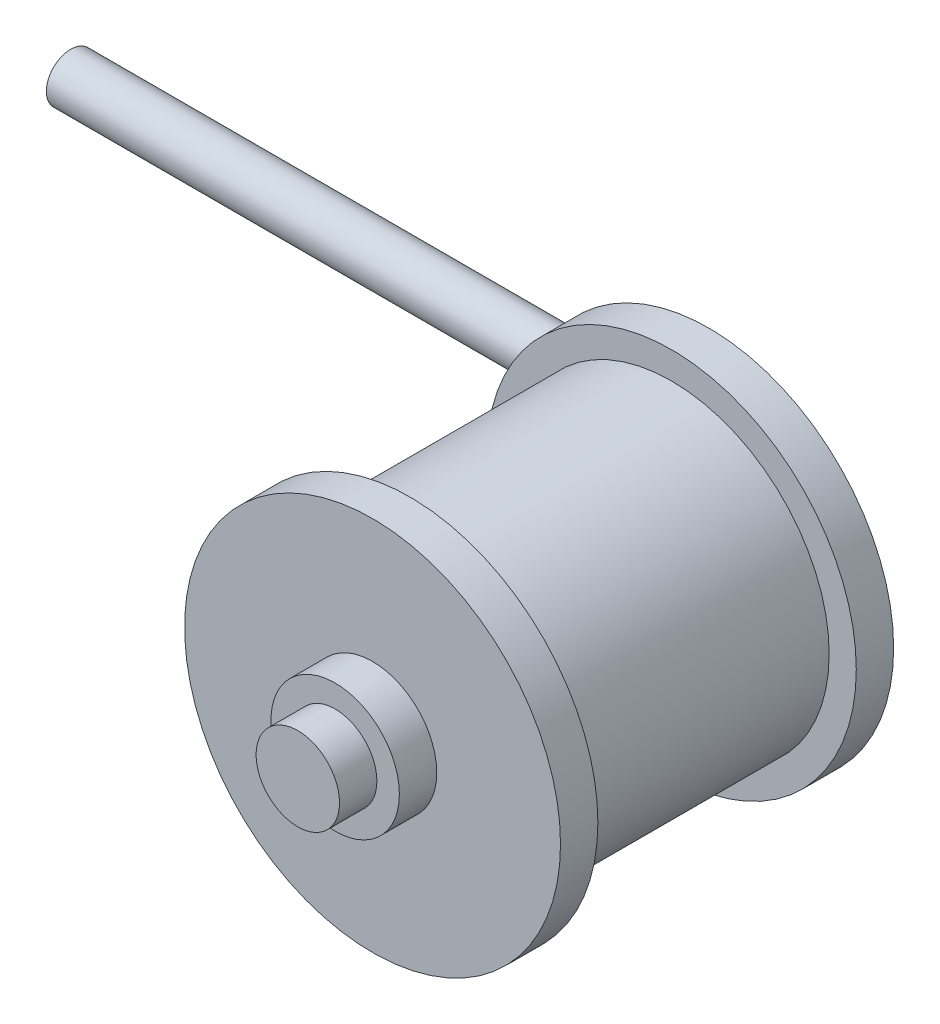
ISO-10303-21;
HEADER;
FILE_DESCRIPTION(('STEP AP214'),'2;1');
FILE_NAME('part.step','',(''),(''),'','','');
FILE_SCHEMA(('AUTOMOTIVE_DESIGN { 1 0 10303 214 1 1 1 1 }'));
ENDSEC;
DATA;
#1=APPLICATION_CONTEXT('core data for automotive mechanical design processes');
#2=APPLICATION_PROTOCOL_DEFINITION('international standard','automotive_design',2000,#1);
#3=PRODUCT_CONTEXT('',#1,'mechanical');
#4=PRODUCT('Part','Part','',(#3));
#5=PRODUCT_RELATED_PRODUCT_CATEGORY('part','',(#4));
#6=PRODUCT_DEFINITION_FORMATION('','',#4);
#7=PRODUCT_DEFINITION_CONTEXT('part definition',#1,'design');
#8=PRODUCT_DEFINITION('design','',#6,#7);
#9=PRODUCT_DEFINITION_SHAPE('','',#8);
#10=(LENGTH_UNIT() NAMED_UNIT(*) SI_UNIT(.MILLI.,.METRE.));
#11=(NAMED_UNIT(*) PLANE_ANGLE_UNIT() SI_UNIT($,.RADIAN.));
#12=(NAMED_UNIT(*) SI_UNIT($,.STERADIAN.) SOLID_ANGLE_UNIT());
#13=UNCERTAINTY_MEASURE_WITH_UNIT(LENGTH_MEASURE(1.E-05),#10,'distance_accuracy_value','');
#14=(GEOMETRIC_REPRESENTATION_CONTEXT(3) GLOBAL_UNCERTAINTY_ASSIGNED_CONTEXT((#13)) GLOBAL_UNIT_ASSIGNED_CONTEXT((#10,
#11,#12)) REPRESENTATION_CONTEXT('',''));
#15=CARTESIAN_POINT('',(0.,0.,0.));
#16=DIRECTION('',(0.,0.,1.));
#17=DIRECTION('',(1.,0.,0.));
#18=AXIS2_PLACEMENT_3D('',#15,#16,#17);
#19=CARTESIAN_POINT('',(0.,0.,23.2833904424024));
#20=DIRECTION('',(0.,0.,-1.));
#21=DIRECTION('',(-1.,0.,0.));
#22=AXIS2_PLACEMENT_3D('',#19,#20,#21);
#23=CYLINDRICAL_SURFACE('',#22,31.1498872920913);
#24=CARTESIAN_POINT('',(0.,0.,23.2833904424024));
#25=DIRECTION('',(0.,0.,1.));
#26=DIRECTION('',(1.,0.,0.));
#27=AXIS2_PLACEMENT_3D('',#24,#25,#26);
#28=CIRCLE('',#27,31.1498872920913);
#29=CARTESIAN_POINT('',(31.1498872920913,0.,23.2833904424024));
#30=VERTEX_POINT('',#29);
#31=EDGE_CURVE('E83',#30,#30,#28,.T.);
#32=ORIENTED_EDGE('',*,*,#31,.F.);
#33=EDGE_LOOP('',(#32));
#34=FACE_BOUND('',#33,.T.);
#35=CARTESIAN_POINT('',(0.,0.,16.9833904424024));
#36=DIRECTION('',(0.,0.,1.));
#37=DIRECTION('',(1.,0.,0.));
#38=AXIS2_PLACEMENT_3D('',#35,#36,#37);
#39=CIRCLE('',#38,31.1498872920913);
#40=CARTESIAN_POINT('',(31.1498872920913,0.,16.9833904424024));
#41=VERTEX_POINT('',#40);
#42=EDGE_CURVE('E42',#41,#41,#39,.T.);
#43=ORIENTED_EDGE('',*,*,#42,.T.);
#44=EDGE_LOOP('',(#43));
#45=FACE_BOUND('',#44,.T.);
#46=ADVANCED_FACE('F39',(#34,#45),#23,.T.);
#47=CARTESIAN_POINT('',(0.,0.,23.2833904424024));
#48=DIRECTION('',(0.,0.,1.));
#49=DIRECTION('',(1.,0.,0.));
#50=AXIS2_PLACEMENT_3D('',#47,#48,#49);
#51=PLANE('',#50);
#52=CARTESIAN_POINT('',(0.,0.,23.2833904424024));
#53=DIRECTION('',(0.,0.,1.));
#54=DIRECTION('',(1.,0.,0.));
#55=AXIS2_PLACEMENT_3D('',#52,#53,#54);
#56=CIRCLE('',#55,26.5774041878868);
#57=CARTESIAN_POINT('',(26.5774041878868,0.,23.2833904424024));
#58=VERTEX_POINT('',#57);
#59=EDGE_CURVE('E73',#58,#58,#56,.T.);
#60=ORIENTED_EDGE('',*,*,#59,.F.);
#61=EDGE_LOOP('',(#60));
#62=FACE_BOUND('',#61,.T.);
#63=ORIENTED_EDGE('',*,*,#31,.T.);
#64=EDGE_LOOP('',(#63));
#65=FACE_BOUND('',#64,.T.);
#66=ADVANCED_FACE('F94',(#62,#65),#51,.T.);
#67=CARTESIAN_POINT('',(0.,0.,16.9833904424024));
#68=DIRECTION('',(0.,0.,1.));
#69=DIRECTION('',(1.,0.,0.));
#70=AXIS2_PLACEMENT_3D('',#67,#68,#69);
#71=PLANE('',#70);
#72=CARTESIAN_POINT('',(0.,0.,16.9833904424024));
#73=DIRECTION('',(0.,0.,-1.));
#74=DIRECTION('',(-1.,0.,0.));
#75=AXIS2_PLACEMENT_3D('',#72,#73,#74);
#76=CIRCLE('',#75,8.62832199090482);
#77=CARTESIAN_POINT('',(-8.62832199090482,0.,16.9833904424024));
#78=VERTEX_POINT('',#77);
#79=EDGE_CURVE('E67',#78,#78,#76,.T.);
#80=ORIENTED_EDGE('',*,*,#79,.F.);
#81=EDGE_LOOP('',(#80));
#82=FACE_BOUND('',#81,.T.);
#83=ORIENTED_EDGE('',*,*,#42,.F.);
#84=EDGE_LOOP('',(#83));
#85=FACE_BOUND('',#84,.T.);
#86=ADVANCED_FACE('F91',(#82,#85),#71,.F.);
#87=CARTESIAN_POINT('',(0.,0.,67.3833904424024));
#88=DIRECTION('',(0.,0.,-1.));
#89=DIRECTION('',(-1.,0.,0.));
#90=AXIS2_PLACEMENT_3D('',#87,#88,#89);
#91=CYLINDRICAL_SURFACE('',#90,26.5774041878868);
#92=CARTESIAN_POINT('',(0.,0.,67.3833904424024));
#93=DIRECTION('',(0.,0.,1.));
#94=DIRECTION('',(1.,0.,0.));
#95=AXIS2_PLACEMENT_3D('',#92,#93,#94);
#96=CIRCLE('',#95,26.5774041878868);
#97=CARTESIAN_POINT('',(26.5774041878868,0.,67.3833904424024));
#98=VERTEX_POINT('',#97);
#99=EDGE_CURVE('E77',#98,#98,#96,.T.);
#100=ORIENTED_EDGE('',*,*,#99,.F.);
#101=EDGE_LOOP('',(#100));
#102=FACE_BOUND('',#101,.T.);
#103=ORIENTED_EDGE('',*,*,#59,.T.);
#104=EDGE_LOOP('',(#103));
#105=FACE_BOUND('',#104,.T.);
#106=ADVANCED_FACE('F93',(#102,#105),#91,.T.);
#107=CARTESIAN_POINT('',(0.,0.,73.6833904424024));
#108=DIRECTION('',(0.,0.,-1.));
#109=DIRECTION('',(-1.,0.,0.));
#110=AXIS2_PLACEMENT_3D('',#107,#108,#109);
#111=CYLINDRICAL_SURFACE('',#110,31.688665598706);
#112=CARTESIAN_POINT('',(0.,0.,73.6833904424024));
#113=DIRECTION('',(0.,0.,1.));
#114=DIRECTION('',(1.,0.,0.));
#115=AXIS2_PLACEMENT_3D('',#112,#113,#114);
#116=CIRCLE('',#115,31.688665598706);
#117=CARTESIAN_POINT('',(31.688665598706,0.,73.6833904424024));
#118=VERTEX_POINT('',#117);
#119=EDGE_CURVE('E74',#118,#118,#116,.T.);
#120=ORIENTED_EDGE('',*,*,#119,.F.);
#121=EDGE_LOOP('',(#120));
#122=FACE_BOUND('',#121,.T.);
#123=CARTESIAN_POINT('',(0.,0.,67.3833904424024));
#124=DIRECTION('',(0.,0.,1.));
#125=DIRECTION('',(1.,0.,0.));
#126=AXIS2_PLACEMENT_3D('',#123,#124,#125);
#127=CIRCLE('',#126,31.688665598706);
#128=CARTESIAN_POINT('',(31.688665598706,0.,67.3833904424024));
#129=VERTEX_POINT('',#128);
#130=EDGE_CURVE('E70',#129,#129,#127,.T.);
#131=ORIENTED_EDGE('',*,*,#130,.T.);
#132=EDGE_LOOP('',(#131));
#133=FACE_BOUND('',#132,.T.);
#134=ADVANCED_FACE('F100',(#122,#133),#111,.T.);
#135=CARTESIAN_POINT('',(0.,0.,73.6833904424024));
#136=DIRECTION('',(0.,0.,1.));
#137=DIRECTION('',(1.,0.,0.));
#138=AXIS2_PLACEMENT_3D('',#135,#136,#137);
#139=PLANE('',#138);
#140=CARTESIAN_POINT('',(0.,0.,73.6833904424024));
#141=DIRECTION('',(0.,0.,1.));
#142=DIRECTION('',(1.,0.,0.));
#143=AXIS2_PLACEMENT_3D('',#140,#141,#142);
#144=CIRCLE('',#143,10.8213425953636);
#145=CARTESIAN_POINT('',(10.8213425953636,0.,73.6833904424024));
#146=VERTEX_POINT('',#145);
#147=EDGE_CURVE('E51',#146,#146,#144,.T.);
#148=ORIENTED_EDGE('',*,*,#147,.F.);
#149=EDGE_LOOP('',(#148));
#150=FACE_BOUND('',#149,.T.);
#151=ORIENTED_EDGE('',*,*,#119,.T.);
#152=EDGE_LOOP('',(#151));
#153=FACE_BOUND('',#152,.T.);
#154=ADVANCED_FACE('F133',(#150,#153),#139,.T.);
#155=CARTESIAN_POINT('',(0.,0.,67.3833904424024));
#156=DIRECTION('',(0.,0.,1.));
#157=DIRECTION('',(1.,0.,0.));
#158=AXIS2_PLACEMENT_3D('',#155,#156,#157);
#159=PLANE('',#158);
#160=ORIENTED_EDGE('',*,*,#99,.T.);
#161=EDGE_LOOP('',(#160));
#162=FACE_BOUND('',#161,.T.);
#163=ORIENTED_EDGE('',*,*,#130,.F.);
#164=EDGE_LOOP('',(#163));
#165=FACE_BOUND('',#164,.T.);
#166=ADVANCED_FACE('F143',(#162,#165),#159,.F.);
#167=CARTESIAN_POINT('',(0.,0.,10.6833904424024));
#168=DIRECTION('',(0.,0.,1.));
#169=DIRECTION('',(1.,0.,0.));
#170=AXIS2_PLACEMENT_3D('',#167,#168,#169);
#171=CYLINDRICAL_SURFACE('',#170,8.62832199090482);
#172=CARTESIAN_POINT('',(0.,0.,10.6833904424024));
#173=DIRECTION('',(0.,0.,-1.));
#174=DIRECTION('',(-1.,0.,0.));
#175=AXIS2_PLACEMENT_3D('',#172,#173,#174);
#176=CIRCLE('',#175,8.62832199090482);
#177=CARTESIAN_POINT('',(-8.62832199090482,0.,10.6833904424024));
#178=VERTEX_POINT('',#177);
#179=EDGE_CURVE('E64',#178,#178,#176,.T.);
#180=ORIENTED_EDGE('',*,*,#179,.F.);
#181=EDGE_LOOP('',(#180));
#182=FACE_BOUND('',#181,.T.);
#183=ORIENTED_EDGE('',*,*,#79,.T.);
#184=EDGE_LOOP('',(#183));
#185=FACE_BOUND('',#184,.T.);
#186=ADVANCED_FACE('F153',(#182,#185),#171,.T.);
#187=CARTESIAN_POINT('',(0.,0.,10.6833904424024));
#188=DIRECTION('',(0.,0.,-1.));
#189=DIRECTION('',(-1.,0.,0.));
#190=AXIS2_PLACEMENT_3D('',#187,#188,#189);
#191=PLANE('',#190);
#192=CARTESIAN_POINT('',(0.,0.,10.6833904424024));
#193=DIRECTION('',(0.,0.,-1.));
#194=DIRECTION('',(-1.,0.,0.));
#195=AXIS2_PLACEMENT_3D('',#192,#193,#194);
#196=CIRCLE('',#195,4.10471329765487);
#197=CARTESIAN_POINT('',(-4.10471329765487,0.,10.6833904424024));
#198=VERTEX_POINT('',#197);
#199=EDGE_CURVE('E11',#198,#198,#196,.T.);
#200=ORIENTED_EDGE('',*,*,#199,.F.);
#201=EDGE_LOOP('',(#200));
#202=FACE_BOUND('',#201,.T.);
#203=ORIENTED_EDGE('',*,*,#179,.T.);
#204=EDGE_LOOP('',(#203));
#205=FACE_BOUND('',#204,.T.);
#206=ADVANCED_FACE('F163',(#202,#205),#191,.T.);
#207=CARTESIAN_POINT('',(0.,0.,79.9833904424024));
#208=DIRECTION('',(0.,0.,-1.));
#209=DIRECTION('',(-1.,0.,0.));
#210=AXIS2_PLACEMENT_3D('',#207,#208,#209);
#211=CYLINDRICAL_SURFACE('',#210,10.8213425953636);
#212=CARTESIAN_POINT('',(0.,0.,79.9833904424024));
#213=DIRECTION('',(0.,0.,1.));
#214=DIRECTION('',(1.,0.,0.));
#215=AXIS2_PLACEMENT_3D('',#212,#213,#214);
#216=CIRCLE('',#215,10.8213425953636);
#217=CARTESIAN_POINT('',(10.8213425953636,0.,79.9833904424024));
#218=VERTEX_POINT('',#217);
#219=EDGE_CURVE('E59',#218,#218,#216,.T.);
#220=ORIENTED_EDGE('',*,*,#219,.F.);
#221=EDGE_LOOP('',(#220));
#222=FACE_BOUND('',#221,.T.);
#223=ORIENTED_EDGE('',*,*,#147,.T.);
#224=EDGE_LOOP('',(#223));
#225=FACE_BOUND('',#224,.T.);
#226=ADVANCED_FACE('F171',(#222,#225),#211,.T.);
#227=CARTESIAN_POINT('',(0.,0.,79.9833904424024));
#228=DIRECTION('',(0.,0.,1.));
#229=DIRECTION('',(1.,0.,0.));
#230=AXIS2_PLACEMENT_3D('',#227,#228,#229);
#231=PLANE('',#230);
#232=CARTESIAN_POINT('',(0.,0.,79.9833904424024));
#233=DIRECTION('',(0.,0.,1.));
#234=DIRECTION('',(1.,0.,0.));
#235=AXIS2_PLACEMENT_3D('',#232,#233,#234);
#236=CIRCLE('',#235,7.02922179875028);
#237=CARTESIAN_POINT('',(7.02922179875028,0.,79.9833904424024));
#238=VERTEX_POINT('',#237);
#239=EDGE_CURVE('E46',#238,#238,#236,.T.);
#240=ORIENTED_EDGE('',*,*,#239,.F.);
#241=EDGE_LOOP('',(#240));
#242=FACE_BOUND('',#241,.T.);
#243=ORIENTED_EDGE('',*,*,#219,.T.);
#244=EDGE_LOOP('',(#243));
#245=FACE_BOUND('',#244,.T.);
#246=ADVANCED_FACE('F176',(#242,#245),#231,.T.);
#247=CARTESIAN_POINT('',(0.,0.,86.2833904424024));
#248=DIRECTION('',(0.,0.,-1.));
#249=DIRECTION('',(-1.,0.,0.));
#250=AXIS2_PLACEMENT_3D('',#247,#248,#249);
#251=CYLINDRICAL_SURFACE('',#250,7.02922179875028);
#252=CARTESIAN_POINT('',(0.,0.,86.2833904424024));
#253=DIRECTION('',(0.,0.,1.));
#254=DIRECTION('',(1.,0.,0.));
#255=AXIS2_PLACEMENT_3D('',#252,#253,#254);
#256=CIRCLE('',#255,7.02922179875028);
#257=CARTESIAN_POINT('',(7.02922179875028,0.,86.2833904424024));
#258=VERTEX_POINT('',#257);
#259=EDGE_CURVE('E57',#258,#258,#256,.T.);
#260=ORIENTED_EDGE('',*,*,#259,.F.);
#261=EDGE_LOOP('',(#260));
#262=FACE_BOUND('',#261,.T.);
#263=ORIENTED_EDGE('',*,*,#239,.T.);
#264=EDGE_LOOP('',(#263));
#265=FACE_BOUND('',#264,.T.);
#266=ADVANCED_FACE('F186',(#262,#265),#251,.T.);
#267=CARTESIAN_POINT('',(0.,0.,86.2833904424024));
#268=DIRECTION('',(0.,0.,1.));
#269=DIRECTION('',(1.,0.,0.));
#270=AXIS2_PLACEMENT_3D('',#267,#268,#269);
#271=PLANE('',#270);
#272=ORIENTED_EDGE('',*,*,#259,.T.);
#273=EDGE_LOOP('',(#272));
#274=FACE_BOUND('',#273,.T.);
#275=ADVANCED_FACE('F196',(#274),#271,.T.);
#276=CARTESIAN_POINT('',(0.,0.,8.68339044240242));
#277=DIRECTION('',(0.,0.,1.));
#278=DIRECTION('',(1.,0.,0.));
#279=AXIS2_PLACEMENT_3D('',#276,#277,#278);
#280=CYLINDRICAL_SURFACE('',#279,4.10471329765487);
#281=ORIENTED_EDGE('',*,*,#199,.T.);
#282=EDGE_LOOP('',(#281));
#283=FACE_BOUND('',#282,.T.);
#284=CARTESIAN_POINT('',(0.,0.,3.03576503437597));
#285=DIRECTION('',(-0.707106781186548,0.,-0.707106781186548));
#286=DIRECTION('',(0.707106781186548,0.,-0.707106781186548));
#287=AXIS2_PLACEMENT_3D('',#284,#285,#286);
#288=ELLIPSE('',#287,5.8049412151967,4.10471329765487);
#289=CARTESIAN_POINT('',(4.10471329765487,0.,-1.0689482632789));
#290=VERTEX_POINT('',#289);
#291=EDGE_CURVE('E60',#290,#290,#288,.F.);
#292=ORIENTED_EDGE('',*,*,#291,.T.);
#293=EDGE_LOOP('',(#292));
#294=FACE_BOUND('',#293,.T.);
#295=ADVANCED_FACE('F206',(#283,#294),#280,.T.);
#296=CARTESIAN_POINT('',(-121.537779830689,0.,3.03576503437597));
#297=DIRECTION('',(-1.,0.,0.));
#298=DIRECTION('',(0.,0.,1.));
#299=AXIS2_PLACEMENT_3D('',#296,#297,#298);
#300=PLANE('',#299);
#301=CARTESIAN_POINT('',(-121.537779830689,0.,3.03576503437597));
#302=DIRECTION('',(-1.,0.,0.));
#303=DIRECTION('',(0.,0.,1.));
#304=AXIS2_PLACEMENT_3D('',#301,#302,#303);
#305=CIRCLE('',#304,4.10471329765487);
#306=CARTESIAN_POINT('',(-121.537779830689,0.,7.14047833203084));
#307=VERTEX_POINT('',#306);
#308=EDGE_CURVE('E55',#307,#307,#305,.T.);
#309=ORIENTED_EDGE('',*,*,#308,.T.);
#310=EDGE_LOOP('',(#309));
#311=FACE_BOUND('',#310,.T.);
#312=ADVANCED_FACE('F224',(#311),#300,.T.);
#313=CARTESIAN_POINT('',(4.61518462742035,0.,3.03576503437597));
#314=DIRECTION('',(-1.,0.,0.));
#315=DIRECTION('',(0.,0.,1.));
#316=AXIS2_PLACEMENT_3D('',#313,#314,#315);
#317=CYLINDRICAL_SURFACE('',#316,4.10471329765487);
#318=ORIENTED_EDGE('',*,*,#291,.F.);
#319=EDGE_LOOP('',(#318));
#320=FACE_BOUND('',#319,.T.);
#321=ORIENTED_EDGE('',*,*,#308,.F.);
#322=EDGE_LOOP('',(#321));
#323=FACE_BOUND('',#322,.T.);
#324=ADVANCED_FACE('F226',(#320,#323),#317,.T.);
#325=CLOSED_SHELL('',(#46,#66,#86,#106,#134,#154,#166,#186,#206,#226,#246,#266,#275,#295,#312,#324));
#326=MANIFOLD_SOLID_BREP('B2',#325);
#327=ADVANCED_BREP_SHAPE_REPRESENTATION('',(#18,#326),#14);
#328=SHAPE_DEFINITION_REPRESENTATION(#9,#327);
ENDSEC;
END-ISO-10303-21;
